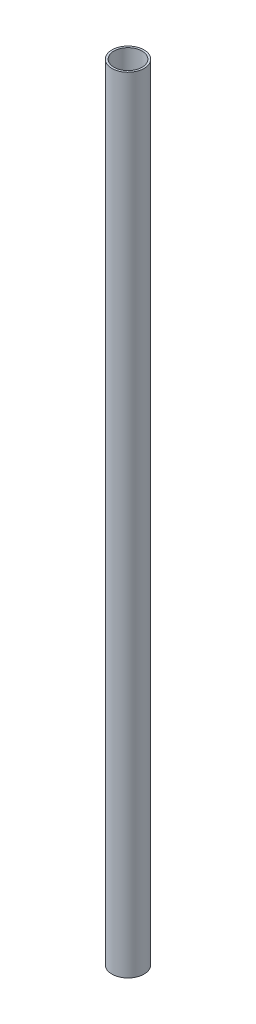
ISO-10303-21;
HEADER;
FILE_DESCRIPTION(('STEP AP214'),'2;1');
FILE_NAME('part.step','',(''),(''),'','','');
FILE_SCHEMA(('AUTOMOTIVE_DESIGN { 1 0 10303 214 1 1 1 1 }'));
ENDSEC;
DATA;
#1=APPLICATION_CONTEXT('core data for automotive mechanical design processes');
#2=APPLICATION_PROTOCOL_DEFINITION('international standard','automotive_design',2000,#1);
#3=PRODUCT_CONTEXT('',#1,'mechanical');
#4=PRODUCT('Part','Part','',(#3));
#5=PRODUCT_RELATED_PRODUCT_CATEGORY('part','',(#4));
#6=PRODUCT_DEFINITION_FORMATION('','',#4);
#7=PRODUCT_DEFINITION_CONTEXT('part definition',#1,'design');
#8=PRODUCT_DEFINITION('design','',#6,#7);
#9=PRODUCT_DEFINITION_SHAPE('','',#8);
#10=(LENGTH_UNIT() NAMED_UNIT(*) SI_UNIT(.MILLI.,.METRE.));
#11=(NAMED_UNIT(*) PLANE_ANGLE_UNIT() SI_UNIT($,.RADIAN.));
#12=(NAMED_UNIT(*) SI_UNIT($,.STERADIAN.) SOLID_ANGLE_UNIT());
#13=UNCERTAINTY_MEASURE_WITH_UNIT(LENGTH_MEASURE(1.E-05),#10,'distance_accuracy_value','');
#14=(GEOMETRIC_REPRESENTATION_CONTEXT(3) GLOBAL_UNCERTAINTY_ASSIGNED_CONTEXT((#13)) GLOBAL_UNIT_ASSIGNED_CONTEXT((#10,
#11,#12)) REPRESENTATION_CONTEXT('',''));
#15=CARTESIAN_POINT('',(0.,0.,0.));
#16=DIRECTION('',(0.,0.,1.));
#17=DIRECTION('',(1.,0.,0.));
#18=AXIS2_PLACEMENT_3D('',#15,#16,#17);
#19=CARTESIAN_POINT('',(0.,195.,0.));
#20=DIRECTION('',(0.,1.,0.));
#21=DIRECTION('',(0.,0.,1.));
#22=AXIS2_PLACEMENT_3D('',#19,#20,#21);
#23=PLANE('',#22);
#24=CARTESIAN_POINT('',(0.,195.,0.));
#25=DIRECTION('',(0.,1.,0.));
#26=DIRECTION('',(0.,0.,1.));
#27=AXIS2_PLACEMENT_3D('',#24,#25,#26);
#28=CIRCLE('',#27,4.);
#29=CARTESIAN_POINT('',(0.,195.,4.));
#30=VERTEX_POINT('',#29);
#31=EDGE_CURVE('E10',#30,#30,#28,.T.);
#32=ORIENTED_EDGE('',*,*,#31,.T.);
#33=EDGE_LOOP('',(#32));
#34=FACE_BOUND('',#33,.T.);
#35=CARTESIAN_POINT('',(0.,195.,0.));
#36=DIRECTION('',(0.,1.,0.));
#37=DIRECTION('',(0.,0.,1.));
#38=AXIS2_PLACEMENT_3D('',#35,#36,#37);
#39=CIRCLE('',#38,3.5);
#40=CARTESIAN_POINT('',(0.,195.,3.5));
#41=VERTEX_POINT('',#40);
#42=EDGE_CURVE('E42',#41,#41,#39,.T.);
#43=ORIENTED_EDGE('',*,*,#42,.F.);
#44=EDGE_LOOP('',(#43));
#45=FACE_BOUND('',#44,.T.);
#46=ADVANCED_FACE('F31',(#34,#45),#23,.T.);
#47=CARTESIAN_POINT('',(0.,0.,0.));
#48=DIRECTION('',(0.,1.,0.));
#49=DIRECTION('',(0.,0.,1.));
#50=AXIS2_PLACEMENT_3D('',#47,#48,#49);
#51=PLANE('',#50);
#52=CARTESIAN_POINT('',(0.,0.,0.));
#53=DIRECTION('',(0.,1.,0.));
#54=DIRECTION('',(0.,0.,1.));
#55=AXIS2_PLACEMENT_3D('',#52,#53,#54);
#56=CIRCLE('',#55,4.);
#57=CARTESIAN_POINT('',(0.,0.,4.));
#58=VERTEX_POINT('',#57);
#59=EDGE_CURVE('E35',#58,#58,#56,.T.);
#60=ORIENTED_EDGE('',*,*,#59,.F.);
#61=EDGE_LOOP('',(#60));
#62=FACE_BOUND('',#61,.T.);
#63=CARTESIAN_POINT('',(0.,0.,0.));
#64=DIRECTION('',(0.,1.,0.));
#65=DIRECTION('',(0.,0.,1.));
#66=AXIS2_PLACEMENT_3D('',#63,#64,#65);
#67=CIRCLE('',#66,3.5);
#68=CARTESIAN_POINT('',(0.,0.,3.5));
#69=VERTEX_POINT('',#68);
#70=EDGE_CURVE('E44',#69,#69,#67,.T.);
#71=ORIENTED_EDGE('',*,*,#70,.T.);
#72=EDGE_LOOP('',(#71));
#73=FACE_BOUND('',#72,.T.);
#74=ADVANCED_FACE('F54',(#62,#73),#51,.F.);
#75=CARTESIAN_POINT('',(0.,195.,0.));
#76=DIRECTION('',(0.,-1.,0.));
#77=DIRECTION('',(0.,0.,-1.));
#78=AXIS2_PLACEMENT_3D('',#75,#76,#77);
#79=CYLINDRICAL_SURFACE('',#78,4.);
#80=ORIENTED_EDGE('',*,*,#31,.F.);
#81=EDGE_LOOP('',(#80));
#82=FACE_BOUND('',#81,.T.);
#83=ORIENTED_EDGE('',*,*,#59,.T.);
#84=EDGE_LOOP('',(#83));
#85=FACE_BOUND('',#84,.T.);
#86=ADVANCED_FACE('F33',(#82,#85),#79,.T.);
#87=CARTESIAN_POINT('',(0.,195.,0.));
#88=DIRECTION('',(0.,-1.,0.));
#89=DIRECTION('',(0.,0.,-1.));
#90=AXIS2_PLACEMENT_3D('',#87,#88,#89);
#91=CYLINDRICAL_SURFACE('',#90,3.5);
#92=ORIENTED_EDGE('',*,*,#42,.T.);
#93=EDGE_LOOP('',(#92));
#94=FACE_BOUND('',#93,.T.);
#95=ORIENTED_EDGE('',*,*,#70,.F.);
#96=EDGE_LOOP('',(#95));
#97=FACE_BOUND('',#96,.T.);
#98=ADVANCED_FACE('F50',(#94,#97),#91,.F.);
#99=CLOSED_SHELL('',(#46,#74,#86,#98));
#100=MANIFOLD_SOLID_BREP('B2',#99);
#101=ADVANCED_BREP_SHAPE_REPRESENTATION('',(#18,#100),#14);
#102=SHAPE_DEFINITION_REPRESENTATION(#9,#101);
ENDSEC;
END-ISO-10303-21;
